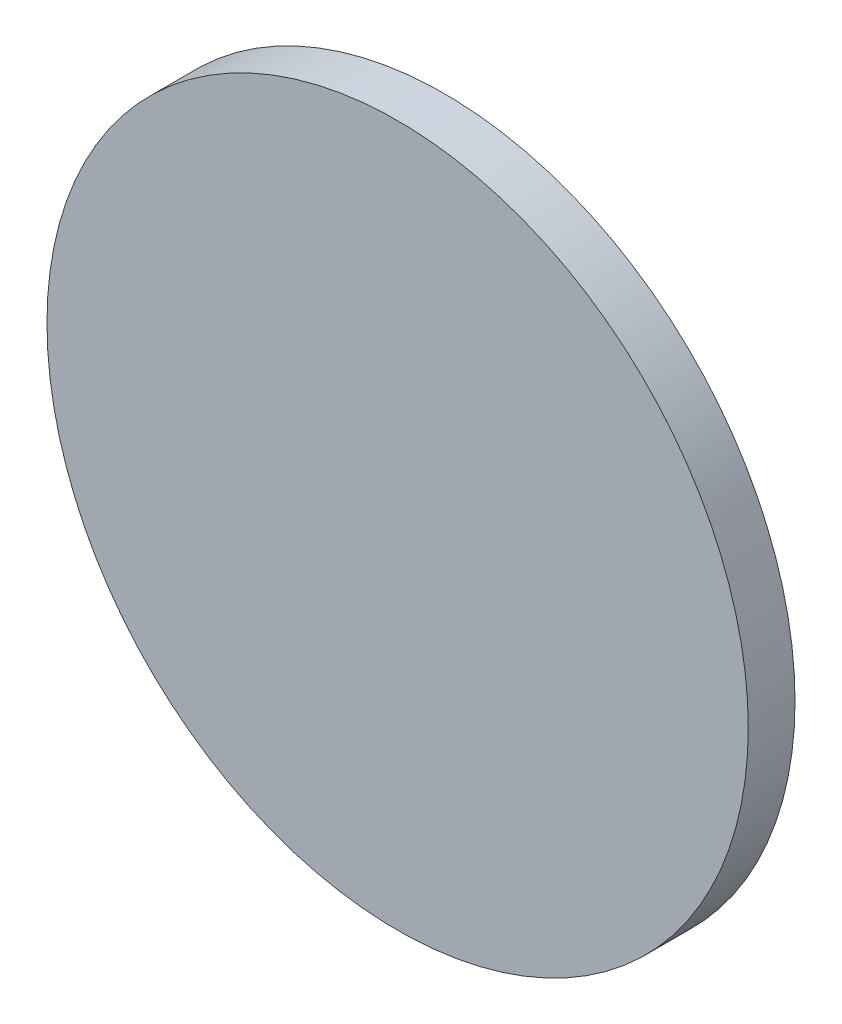
ISO-10303-21;
HEADER;
FILE_DESCRIPTION(('STEP AP214'),'2;1');
FILE_NAME('part.step','',(''),(''),'','','');
FILE_SCHEMA(('AUTOMOTIVE_DESIGN { 1 0 10303 214 1 1 1 1 }'));
ENDSEC;
DATA;
#1=APPLICATION_CONTEXT('core data for automotive mechanical design processes');
#2=APPLICATION_PROTOCOL_DEFINITION('international standard','automotive_design',2000,#1);
#3=PRODUCT_CONTEXT('',#1,'mechanical');
#4=PRODUCT('Part','Part','',(#3));
#5=PRODUCT_RELATED_PRODUCT_CATEGORY('part','',(#4));
#6=PRODUCT_DEFINITION_FORMATION('','',#4);
#7=PRODUCT_DEFINITION_CONTEXT('part definition',#1,'design');
#8=PRODUCT_DEFINITION('design','',#6,#7);
#9=PRODUCT_DEFINITION_SHAPE('','',#8);
#10=(LENGTH_UNIT() NAMED_UNIT(*) SI_UNIT(.MILLI.,.METRE.));
#11=(NAMED_UNIT(*) PLANE_ANGLE_UNIT() SI_UNIT($,.RADIAN.));
#12=(NAMED_UNIT(*) SI_UNIT($,.STERADIAN.) SOLID_ANGLE_UNIT());
#13=UNCERTAINTY_MEASURE_WITH_UNIT(LENGTH_MEASURE(1.E-05),#10,'distance_accuracy_value','');
#14=(GEOMETRIC_REPRESENTATION_CONTEXT(3) GLOBAL_UNCERTAINTY_ASSIGNED_CONTEXT((#13)) GLOBAL_UNIT_ASSIGNED_CONTEXT((#10,
#11,#12)) REPRESENTATION_CONTEXT('',''));
#15=CARTESIAN_POINT('',(0.,0.,0.));
#16=DIRECTION('',(0.,0.,1.));
#17=DIRECTION('',(1.,0.,0.));
#18=AXIS2_PLACEMENT_3D('',#15,#16,#17);
#19=CARTESIAN_POINT('',(0.,0.,2.));
#20=DIRECTION('',(0.,0.,-1.));
#21=DIRECTION('',(-1.,0.,0.));
#22=AXIS2_PLACEMENT_3D('',#19,#20,#21);
#23=CYLINDRICAL_SURFACE('',#22,15.);
#24=CARTESIAN_POINT('',(0.,0.,2.));
#25=DIRECTION('',(0.,0.,1.));
#26=DIRECTION('',(1.,0.,0.));
#27=AXIS2_PLACEMENT_3D('',#24,#25,#26);
#28=CIRCLE('',#27,15.);
#29=CARTESIAN_POINT('',(15.,0.,2.));
#30=VERTEX_POINT('',#29);
#31=EDGE_CURVE('E10',#30,#30,#28,.T.);
#32=ORIENTED_EDGE('',*,*,#31,.F.);
#33=EDGE_LOOP('',(#32));
#34=FACE_BOUND('',#33,.T.);
#35=CARTESIAN_POINT('',(0.,0.,0.));
#36=DIRECTION('',(0.,0.,1.));
#37=DIRECTION('',(1.,0.,0.));
#38=AXIS2_PLACEMENT_3D('',#35,#36,#37);
#39=CIRCLE('',#38,15.);
#40=CARTESIAN_POINT('',(15.,0.,0.));
#41=VERTEX_POINT('',#40);
#42=EDGE_CURVE('E31',#41,#41,#39,.T.);
#43=ORIENTED_EDGE('',*,*,#42,.T.);
#44=EDGE_LOOP('',(#43));
#45=FACE_BOUND('',#44,.T.);
#46=ADVANCED_FACE('F28',(#34,#45),#23,.T.);
#47=CARTESIAN_POINT('',(0.,0.,2.));
#48=DIRECTION('',(0.,0.,1.));
#49=DIRECTION('',(1.,0.,0.));
#50=AXIS2_PLACEMENT_3D('',#47,#48,#49);
#51=PLANE('',#50);
#52=ORIENTED_EDGE('',*,*,#31,.T.);
#53=EDGE_LOOP('',(#52));
#54=FACE_BOUND('',#53,.T.);
#55=ADVANCED_FACE('F43',(#54),#51,.T.);
#56=CARTESIAN_POINT('',(0.,0.,0.));
#57=DIRECTION('',(0.,0.,1.));
#58=DIRECTION('',(1.,0.,0.));
#59=AXIS2_PLACEMENT_3D('',#56,#57,#58);
#60=PLANE('',#59);
#61=ORIENTED_EDGE('',*,*,#42,.F.);
#62=EDGE_LOOP('',(#61));
#63=FACE_BOUND('',#62,.T.);
#64=ADVANCED_FACE('F41',(#63),#60,.F.);
#65=CLOSED_SHELL('',(#46,#55,#64));
#66=MANIFOLD_SOLID_BREP('B2',#65);
#67=ADVANCED_BREP_SHAPE_REPRESENTATION('',(#18,#66),#14);
#68=SHAPE_DEFINITION_REPRESENTATION(#9,#67);
ENDSEC;
END-ISO-10303-21;
